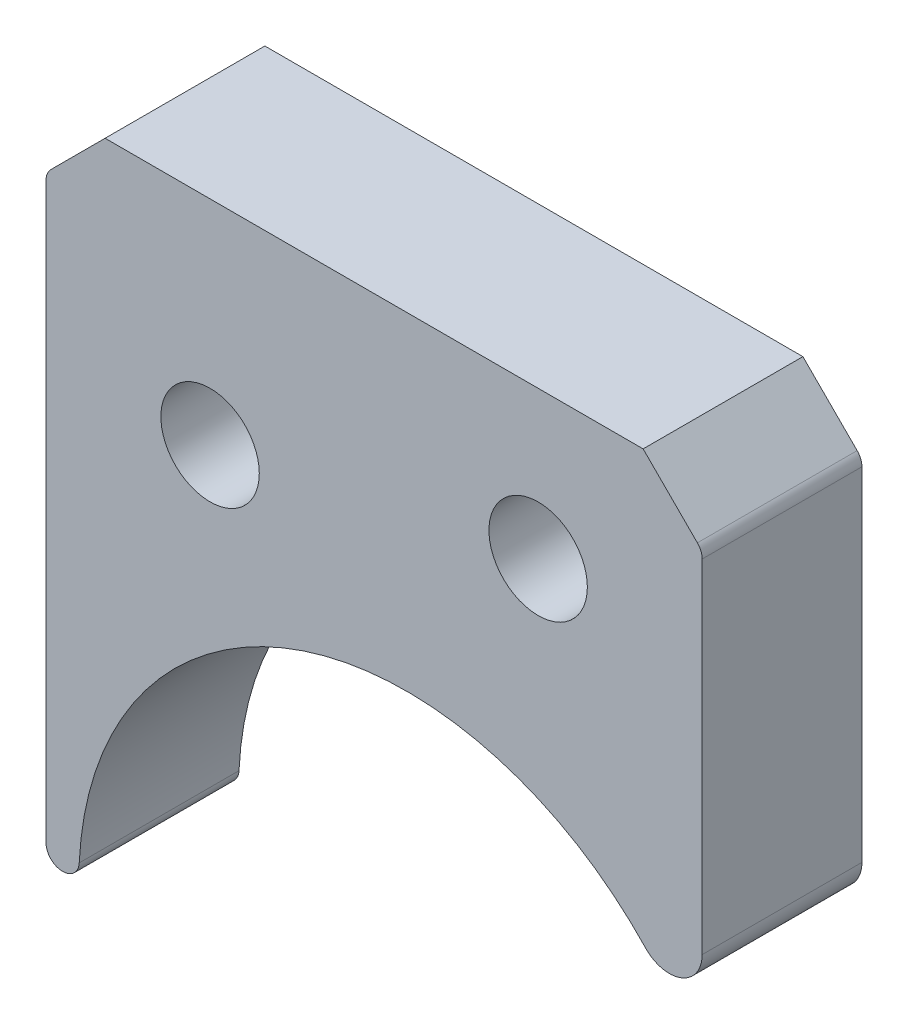
ISO-10303-21;
HEADER;
FILE_DESCRIPTION(('STEP AP214'),'2;1');
FILE_NAME('part.step','',(''),(''),'','','');
FILE_SCHEMA(('AUTOMOTIVE_DESIGN { 1 0 10303 214 1 1 1 1 }'));
ENDSEC;
DATA;
#1=APPLICATION_CONTEXT('core data for automotive mechanical design processes');
#2=APPLICATION_PROTOCOL_DEFINITION('international standard','automotive_design',2000,#1);
#3=PRODUCT_CONTEXT('',#1,'mechanical');
#4=PRODUCT('Part','Part','',(#3));
#5=PRODUCT_RELATED_PRODUCT_CATEGORY('part','',(#4));
#6=PRODUCT_DEFINITION_FORMATION('','',#4);
#7=PRODUCT_DEFINITION_CONTEXT('part definition',#1,'design');
#8=PRODUCT_DEFINITION('design','',#6,#7);
#9=PRODUCT_DEFINITION_SHAPE('','',#8);
#10=(LENGTH_UNIT() NAMED_UNIT(*) SI_UNIT(.MILLI.,.METRE.));
#11=(NAMED_UNIT(*) PLANE_ANGLE_UNIT() SI_UNIT($,.RADIAN.));
#12=(NAMED_UNIT(*) SI_UNIT($,.STERADIAN.) SOLID_ANGLE_UNIT());
#13=UNCERTAINTY_MEASURE_WITH_UNIT(LENGTH_MEASURE(1.E-05),#10,'distance_accuracy_value','');
#14=(GEOMETRIC_REPRESENTATION_CONTEXT(3) GLOBAL_UNCERTAINTY_ASSIGNED_CONTEXT((#13)) GLOBAL_UNIT_ASSIGNED_CONTEXT((#10,
#11,#12)) REPRESENTATION_CONTEXT('',''));
#15=CARTESIAN_POINT('',(0.,0.,0.));
#16=DIRECTION('',(0.,0.,1.));
#17=DIRECTION('',(1.,0.,0.));
#18=AXIS2_PLACEMENT_3D('',#15,#16,#17);
#19=CARTESIAN_POINT('',(0.,0.,4.87));
#20=DIRECTION('',(1.,0.,0.));
#21=DIRECTION('',(0.,0.,-1.));
#22=AXIS2_PLACEMENT_3D('',#19,#20,#21);
#23=PLANE('',#22);
#24=DIRECTION('',(0.,-1.,0.));
#25=VECTOR('',#24,1.);
#26=CARTESIAN_POINT('',(0.,0.,0.));
#27=LINE('',#26,#25);
#28=CARTESIAN_POINT('',(0.,17.9928932188135,0.));
#29=VERTEX_POINT('',#28);
#30=CARTESIAN_POINT('',(0.,0.5,0.));
#31=VERTEX_POINT('',#30);
#32=EDGE_CURVE('E227',#29,#31,#27,.T.);
#33=ORIENTED_EDGE('',*,*,#32,.T.);
#34=DIRECTION('',(0.,0.,-1.));
#35=VECTOR('',#34,1.);
#36=CARTESIAN_POINT('',(0.,0.5,4.87));
#37=LINE('',#36,#35);
#38=CARTESIAN_POINT('',(0.,0.5,4.87));
#39=VERTEX_POINT('',#38);
#40=EDGE_CURVE('E186',#31,#39,#37,.F.);
#41=ORIENTED_EDGE('',*,*,#40,.T.);
#42=DIRECTION('',(0.,-1.,0.));
#43=VECTOR('',#42,1.);
#44=CARTESIAN_POINT('',(0.,0.,4.87));
#45=LINE('',#44,#43);
#46=CARTESIAN_POINT('',(0.,17.9928932188135,4.87));
#47=VERTEX_POINT('',#46);
#48=EDGE_CURVE('E153',#47,#39,#45,.T.);
#49=ORIENTED_EDGE('',*,*,#48,.F.);
#50=DIRECTION('',(0.,0.,1.));
#51=VECTOR('',#50,1.);
#52=CARTESIAN_POINT('',(0.,17.9928932188135,0.));
#53=LINE('',#52,#51);
#54=EDGE_CURVE('E183',#47,#29,#53,.F.);
#55=ORIENTED_EDGE('',*,*,#54,.T.);
#56=EDGE_LOOP('',(#33,#41,#49,#55));
#57=FACE_BOUND('',#56,.T.);
#58=ADVANCED_FACE('F40',(#57),#23,.F.);
#59=CARTESIAN_POINT('',(0.,0.,4.87));
#60=DIRECTION('',(0.,1.,0.));
#61=DIRECTION('',(0.,0.,1.));
#62=AXIS2_PLACEMENT_3D('',#59,#60,#61);
#63=PLANE('',#62);
#64=DIRECTION('',(1.,0.,0.));
#65=VECTOR('',#64,1.);
#66=CARTESIAN_POINT('',(0.,0.,4.87));
#67=LINE('',#66,#65);
#68=CARTESIAN_POINT('',(0.5,0.,4.87));
#69=VERTEX_POINT('',#68);
#70=CARTESIAN_POINT('',(0.511911518298484,0.,4.87));
#71=VERTEX_POINT('',#70);
#72=EDGE_CURVE('E157',#69,#71,#67,.T.);
#73=ORIENTED_EDGE('',*,*,#72,.F.);
#74=DIRECTION('',(0.,0.,-1.));
#75=VECTOR('',#74,1.);
#76=CARTESIAN_POINT('',(0.5,0.,4.87));
#77=LINE('',#76,#75);
#78=CARTESIAN_POINT('',(0.5,0.,0.));
#79=VERTEX_POINT('',#78);
#80=EDGE_CURVE('E172',#69,#79,#77,.T.);
#81=ORIENTED_EDGE('',*,*,#80,.T.);
#82=DIRECTION('',(1.,0.,0.));
#83=VECTOR('',#82,1.);
#84=CARTESIAN_POINT('',(0.,0.,0.));
#85=LINE('',#84,#83);
#86=CARTESIAN_POINT('',(0.511911518298484,0.,0.));
#87=VERTEX_POINT('',#86);
#88=EDGE_CURVE('E230',#79,#87,#85,.T.);
#89=ORIENTED_EDGE('',*,*,#88,.T.);
#90=DIRECTION('',(0.,0.,-1.));
#91=VECTOR('',#90,1.);
#92=CARTESIAN_POINT('',(0.511911518298484,0.,4.87));
#93=LINE('',#92,#91);
#94=EDGE_CURVE('E170',#87,#71,#93,.F.);
#95=ORIENTED_EDGE('',*,*,#94,.T.);
#96=EDGE_LOOP('',(#73,#81,#89,#95));
#97=FACE_BOUND('',#96,.T.);
#98=ADVANCED_FACE('F242',(#97),#63,.F.);
#99=CARTESIAN_POINT('',(11.,0.,4.87));
#100=DIRECTION('',(0.,0.,-1.));
#101=DIRECTION('',(-1.,0.,0.));
#102=AXIS2_PLACEMENT_3D('',#99,#100,#101);
#103=CYLINDRICAL_SURFACE('',#102,10.);
#104=CARTESIAN_POINT('',(11.,0.,0.));
#105=DIRECTION('',(0.,0.,-1.));
#106=DIRECTION('',(1.,0.,0.));
#107=AXIS2_PLACEMENT_3D('',#104,#105,#106);
#108=CIRCLE('',#107,10.);
#109=CARTESIAN_POINT('',(1.01134430314141,0.476190476190476,0.));
#110=VERTEX_POINT('',#109);
#111=CARTESIAN_POINT('',(18.2727272727273,6.86348585024614,0.));
#112=VERTEX_POINT('',#111);
#113=EDGE_CURVE('E159',#110,#112,#108,.T.);
#114=ORIENTED_EDGE('',*,*,#113,.T.);
#115=DIRECTION('',(0.,0.,-1.));
#116=VECTOR('',#115,1.);
#117=CARTESIAN_POINT('',(18.2727272727273,6.86348585024614,4.87));
#118=LINE('',#117,#116);
#119=CARTESIAN_POINT('',(18.2727272727273,6.86348585024614,4.87));
#120=VERTEX_POINT('',#119);
#121=EDGE_CURVE('E48',#112,#120,#118,.F.);
#122=ORIENTED_EDGE('',*,*,#121,.T.);
#123=CARTESIAN_POINT('',(11.,0.,4.87));
#124=DIRECTION('',(0.,0.,-1.));
#125=DIRECTION('',(1.,0.,0.));
#126=AXIS2_PLACEMENT_3D('',#123,#124,#125);
#127=CIRCLE('',#126,10.);
#128=CARTESIAN_POINT('',(1.01134430314141,0.476190476190476,4.87));
#129=VERTEX_POINT('',#128);
#130=EDGE_CURVE('E221',#129,#120,#127,.T.);
#131=ORIENTED_EDGE('',*,*,#130,.F.);
#132=DIRECTION('',(0.,0.,-1.));
#133=VECTOR('',#132,1.);
#134=CARTESIAN_POINT('',(1.01134430314141,0.476190476190476,4.87));
#135=LINE('',#134,#133);
#136=EDGE_CURVE('E196',#129,#110,#135,.T.);
#137=ORIENTED_EDGE('',*,*,#136,.T.);
#138=EDGE_LOOP('',(#114,#122,#131,#137));
#139=FACE_BOUND('',#138,.T.);
#140=ADVANCED_FACE('F233',(#139),#103,.F.);
#141=CARTESIAN_POINT('',(20.,4.35889894354068,4.87));
#142=DIRECTION('',(-1.,0.,0.));
#143=DIRECTION('',(0.,0.,1.));
#144=AXIS2_PLACEMENT_3D('',#141,#142,#143);
#145=PLANE('',#144);
#146=DIRECTION('',(0.,1.,0.));
#147=VECTOR('',#146,1.);
#148=CARTESIAN_POINT('',(20.,4.35889894354068,4.87));
#149=LINE('',#148,#147);
#150=CARTESIAN_POINT('',(20.,7.54983443527076,4.87));
#151=VERTEX_POINT('',#150);
#152=CARTESIAN_POINT('',(20.,17.9928932188135,4.87));
#153=VERTEX_POINT('',#152);
#154=EDGE_CURVE('E212',#151,#153,#149,.T.);
#155=ORIENTED_EDGE('',*,*,#154,.F.);
#156=DIRECTION('',(0.,0.,-1.));
#157=VECTOR('',#156,1.);
#158=CARTESIAN_POINT('',(20.,7.54983443527076,4.87));
#159=LINE('',#158,#157);
#160=CARTESIAN_POINT('',(20.,7.54983443527076,0.));
#161=VERTEX_POINT('',#160);
#162=EDGE_CURVE('E205',#151,#161,#159,.T.);
#163=ORIENTED_EDGE('',*,*,#162,.T.);
#164=DIRECTION('',(0.,1.,0.));
#165=VECTOR('',#164,1.);
#166=CARTESIAN_POINT('',(20.,4.35889894354068,0.));
#167=LINE('',#166,#165);
#168=CARTESIAN_POINT('',(20.,17.9928932188135,0.));
#169=VERTEX_POINT('',#168);
#170=EDGE_CURVE('E154',#161,#169,#167,.T.);
#171=ORIENTED_EDGE('',*,*,#170,.T.);
#172=DIRECTION('',(0.,0.,-1.));
#173=VECTOR('',#172,1.);
#174=CARTESIAN_POINT('',(20.,17.9928932188135,4.87));
#175=LINE('',#174,#173);
#176=EDGE_CURVE('E199',#169,#153,#175,.F.);
#177=ORIENTED_EDGE('',*,*,#176,.T.);
#178=EDGE_LOOP('',(#155,#163,#171,#177));
#179=FACE_BOUND('',#178,.T.);
#180=ADVANCED_FACE('F211',(#179),#145,.F.);
#181=CARTESIAN_POINT('',(0.,20.,4.87));
#182=DIRECTION('',(0.,-1.,0.));
#183=DIRECTION('',(0.,0.,-1.));
#184=AXIS2_PLACEMENT_3D('',#181,#182,#183);
#185=PLANE('',#184);
#186=DIRECTION('',(-1.,0.,0.));
#187=VECTOR('',#186,1.);
#188=CARTESIAN_POINT('',(0.,20.,0.));
#189=LINE('',#188,#187);
#190=CARTESIAN_POINT('',(18.2,20.,0.));
#191=VERTEX_POINT('',#190);
#192=CARTESIAN_POINT('',(1.8,20.,0.));
#193=VERTEX_POINT('',#192);
#194=EDGE_CURVE('E146',#191,#193,#189,.T.);
#195=ORIENTED_EDGE('',*,*,#194,.T.);
#196=DIRECTION('',(0.,0.,1.));
#197=VECTOR('',#196,1.);
#198=CARTESIAN_POINT('',(1.8,20.,4.87));
#199=LINE('',#198,#197);
#200=CARTESIAN_POINT('',(1.8,20.,4.87));
#201=VERTEX_POINT('',#200);
#202=EDGE_CURVE('E149',#193,#201,#199,.T.);
#203=ORIENTED_EDGE('',*,*,#202,.T.);
#204=DIRECTION('',(-1.,0.,0.));
#205=VECTOR('',#204,1.);
#206=CARTESIAN_POINT('',(0.,20.,4.87));
#207=LINE('',#206,#205);
#208=CARTESIAN_POINT('',(18.2,20.,4.87));
#209=VERTEX_POINT('',#208);
#210=EDGE_CURVE('E140',#209,#201,#207,.T.);
#211=ORIENTED_EDGE('',*,*,#210,.F.);
#212=DIRECTION('',(0.,0.,-1.));
#213=VECTOR('',#212,1.);
#214=CARTESIAN_POINT('',(18.2,20.,4.87));
#215=LINE('',#214,#213);
#216=EDGE_CURVE('E133',#209,#191,#215,.T.);
#217=ORIENTED_EDGE('',*,*,#216,.T.);
#218=EDGE_LOOP('',(#195,#203,#211,#217));
#219=FACE_BOUND('',#218,.T.);
#220=ADVANCED_FACE('F145',(#219),#185,.F.);
#221=CARTESIAN_POINT('',(11.,0.,4.87));
#222=DIRECTION('',(0.,0.,1.));
#223=DIRECTION('',(1.,0.,0.));
#224=AXIS2_PLACEMENT_3D('',#221,#222,#223);
#225=PLANE('',#224);
#226=CARTESIAN_POINT('',(5.,13.5,4.87));
#227=DIRECTION('',(0.,0.,1.));
#228=DIRECTION('',(1.,0.,0.));
#229=AXIS2_PLACEMENT_3D('',#226,#227,#228);
#230=CIRCLE('',#229,1.5);
#231=CARTESIAN_POINT('',(6.5,13.5,4.87));
#232=VERTEX_POINT('',#231);
#233=EDGE_CURVE('E424',#232,#232,#230,.T.);
#234=ORIENTED_EDGE('',*,*,#233,.F.);
#235=EDGE_LOOP('',(#234));
#236=FACE_BOUND('',#235,.T.);
#237=CARTESIAN_POINT('',(15.,15.5,4.87));
#238=DIRECTION('',(0.,0.,1.));
#239=DIRECTION('',(1.,0.,0.));
#240=AXIS2_PLACEMENT_3D('',#237,#238,#239);
#241=CIRCLE('',#240,1.5);
#242=CARTESIAN_POINT('',(16.5,15.5,4.87));
#243=VERTEX_POINT('',#242);
#244=EDGE_CURVE('E422',#243,#243,#241,.T.);
#245=ORIENTED_EDGE('',*,*,#244,.F.);
#246=EDGE_LOOP('',(#245));
#247=FACE_BOUND('',#246,.T.);
#248=ORIENTED_EDGE('',*,*,#130,.T.);
#249=CARTESIAN_POINT('',(19.,7.54983443527076,4.87));
#250=DIRECTION('',(0.,0.,1.));
#251=DIRECTION('',(1.,0.,0.));
#252=AXIS2_PLACEMENT_3D('',#249,#250,#251);
#253=CIRCLE('',#252,1.);
#254=EDGE_CURVE('E11',#120,#151,#253,.T.);
#255=ORIENTED_EDGE('',*,*,#254,.T.);
#256=ORIENTED_EDGE('',*,*,#154,.T.);
#257=CARTESIAN_POINT('',(19.5,17.9928932188135,4.87));
#258=DIRECTION('',(0.,0.,1.));
#259=DIRECTION('',(1.,0.,0.));
#260=AXIS2_PLACEMENT_3D('',#257,#258,#259);
#261=CIRCLE('',#260,0.5);
#262=CARTESIAN_POINT('',(19.8535533905933,18.3464466094067,4.87));
#263=VERTEX_POINT('',#262);
#264=EDGE_CURVE('E190',#153,#263,#261,.T.);
#265=ORIENTED_EDGE('',*,*,#264,.T.);
#266=DIRECTION('',(0.707106781186546,-0.707106781186549,0.));
#267=VECTOR('',#266,1.);
#268=CARTESIAN_POINT('',(24.6,13.6,4.87));
#269=LINE('',#268,#267);
#270=EDGE_CURVE('E165',#263,#209,#269,.F.);
#271=ORIENTED_EDGE('',*,*,#270,.T.);
#272=ORIENTED_EDGE('',*,*,#210,.T.);
#273=DIRECTION('',(0.707106781186549,0.707106781186546,0.));
#274=VECTOR('',#273,1.);
#275=CARTESIAN_POINT('',(-3.59999999999998,14.6,4.87));
#276=LINE('',#275,#274);
#277=CARTESIAN_POINT('',(0.146446609406727,18.3464466094067,4.87));
#278=VERTEX_POINT('',#277);
#279=EDGE_CURVE('E167',#201,#278,#276,.F.);
#280=ORIENTED_EDGE('',*,*,#279,.T.);
#281=CARTESIAN_POINT('',(0.5,17.9928932188135,4.87));
#282=DIRECTION('',(0.,0.,1.));
#283=DIRECTION('',(1.,0.,0.));
#284=AXIS2_PLACEMENT_3D('',#281,#282,#283);
#285=CIRCLE('',#284,0.5);
#286=EDGE_CURVE('E188',#278,#47,#285,.T.);
#287=ORIENTED_EDGE('',*,*,#286,.T.);
#288=ORIENTED_EDGE('',*,*,#48,.T.);
#289=CARTESIAN_POINT('',(0.5,0.5,4.87));
#290=DIRECTION('',(0.,0.,1.));
#291=DIRECTION('',(1.,0.,0.));
#292=AXIS2_PLACEMENT_3D('',#289,#290,#291);
#293=CIRCLE('',#292,0.5);
#294=EDGE_CURVE('E194',#39,#69,#293,.T.);
#295=ORIENTED_EDGE('',*,*,#294,.T.);
#296=ORIENTED_EDGE('',*,*,#72,.T.);
#297=CARTESIAN_POINT('',(0.511911518298484,0.5,4.87));
#298=DIRECTION('',(0.,0.,1.));
#299=DIRECTION('',(1.,0.,0.));
#300=AXIS2_PLACEMENT_3D('',#297,#298,#299);
#301=CIRCLE('',#300,0.5);
#302=EDGE_CURVE('E192',#71,#129,#301,.T.);
#303=ORIENTED_EDGE('',*,*,#302,.T.);
#304=EDGE_LOOP('',(#248,#255,#256,#265,#271,#272,#280,#287,#288,#295,#296,#303));
#305=FACE_BOUND('',#304,.T.);
#306=ADVANCED_FACE('F220',(#236,#247,#305),#225,.T.);
#307=CARTESIAN_POINT('',(11.,0.,0.));
#308=DIRECTION('',(0.,0.,1.));
#309=DIRECTION('',(1.,0.,0.));
#310=AXIS2_PLACEMENT_3D('',#307,#308,#309);
#311=PLANE('',#310);
#312=CARTESIAN_POINT('',(5.,13.5,0.));
#313=DIRECTION('',(0.,0.,1.));
#314=DIRECTION('',(1.,0.,0.));
#315=AXIS2_PLACEMENT_3D('',#312,#313,#314);
#316=CIRCLE('',#315,1.5);
#317=CARTESIAN_POINT('',(6.5,13.5,0.));
#318=VERTEX_POINT('',#317);
#319=EDGE_CURVE('E231',#318,#318,#316,.T.);
#320=ORIENTED_EDGE('',*,*,#319,.T.);
#321=EDGE_LOOP('',(#320));
#322=FACE_BOUND('',#321,.T.);
#323=CARTESIAN_POINT('',(15.,15.5,0.));
#324=DIRECTION('',(0.,0.,1.));
#325=DIRECTION('',(1.,0.,0.));
#326=AXIS2_PLACEMENT_3D('',#323,#324,#325);
#327=CIRCLE('',#326,1.5);
#328=CARTESIAN_POINT('',(16.5,15.5,0.));
#329=VERTEX_POINT('',#328);
#330=EDGE_CURVE('E419',#329,#329,#327,.T.);
#331=ORIENTED_EDGE('',*,*,#330,.T.);
#332=EDGE_LOOP('',(#331));
#333=FACE_BOUND('',#332,.T.);
#334=ORIENTED_EDGE('',*,*,#170,.F.);
#335=CARTESIAN_POINT('',(19.,7.54983443527076,0.));
#336=DIRECTION('',(0.,0.,1.));
#337=DIRECTION('',(1.,0.,0.));
#338=AXIS2_PLACEMENT_3D('',#335,#336,#337);
#339=CIRCLE('',#338,1.);
#340=EDGE_CURVE('E62',#161,#112,#339,.F.);
#341=ORIENTED_EDGE('',*,*,#340,.T.);
#342=ORIENTED_EDGE('',*,*,#113,.F.);
#343=CARTESIAN_POINT('',(0.511911518298484,0.5,0.));
#344=DIRECTION('',(0.,0.,1.));
#345=DIRECTION('',(1.,0.,0.));
#346=AXIS2_PLACEMENT_3D('',#343,#344,#345);
#347=CIRCLE('',#346,0.5);
#348=EDGE_CURVE('E179',#110,#87,#347,.F.);
#349=ORIENTED_EDGE('',*,*,#348,.T.);
#350=ORIENTED_EDGE('',*,*,#88,.F.);
#351=CARTESIAN_POINT('',(0.5,0.5,0.));
#352=DIRECTION('',(0.,0.,1.));
#353=DIRECTION('',(1.,0.,0.));
#354=AXIS2_PLACEMENT_3D('',#351,#352,#353);
#355=CIRCLE('',#354,0.5);
#356=EDGE_CURVE('E181',#79,#31,#355,.F.);
#357=ORIENTED_EDGE('',*,*,#356,.T.);
#358=ORIENTED_EDGE('',*,*,#32,.F.);
#359=CARTESIAN_POINT('',(0.5,17.9928932188135,0.));
#360=DIRECTION('',(0.,0.,1.));
#361=DIRECTION('',(1.,0.,0.));
#362=AXIS2_PLACEMENT_3D('',#359,#360,#361);
#363=CIRCLE('',#362,0.5);
#364=CARTESIAN_POINT('',(0.146446609406728,18.3464466094067,0.));
#365=VERTEX_POINT('',#364);
#366=EDGE_CURVE('E175',#29,#365,#363,.F.);
#367=ORIENTED_EDGE('',*,*,#366,.T.);
#368=DIRECTION('',(-0.707106781186549,-0.707106781186546,0.));
#369=VECTOR('',#368,1.);
#370=CARTESIAN_POINT('',(0.,18.2,0.));
#371=LINE('',#370,#369);
#372=EDGE_CURVE('E139',#365,#193,#371,.F.);
#373=ORIENTED_EDGE('',*,*,#372,.T.);
#374=ORIENTED_EDGE('',*,*,#194,.F.);
#375=DIRECTION('',(-0.707106781186546,0.707106781186549,0.));
#376=VECTOR('',#375,1.);
#377=CARTESIAN_POINT('',(18.2,20.,0.));
#378=LINE('',#377,#376);
#379=CARTESIAN_POINT('',(19.8535533905933,18.3464466094067,0.));
#380=VERTEX_POINT('',#379);
#381=EDGE_CURVE('E129',#191,#380,#378,.F.);
#382=ORIENTED_EDGE('',*,*,#381,.T.);
#383=CARTESIAN_POINT('',(19.5,17.9928932188135,0.));
#384=DIRECTION('',(0.,0.,1.));
#385=DIRECTION('',(1.,0.,0.));
#386=AXIS2_PLACEMENT_3D('',#383,#384,#385);
#387=CIRCLE('',#386,0.5);
#388=EDGE_CURVE('E177',#380,#169,#387,.F.);
#389=ORIENTED_EDGE('',*,*,#388,.T.);
#390=EDGE_LOOP('',(#334,#341,#342,#349,#350,#357,#358,#367,#373,#374,#382,#389));
#391=FACE_BOUND('',#390,.T.);
#392=ADVANCED_FACE('F151',(#322,#333,#391),#311,.F.);
#393=CARTESIAN_POINT('',(15.,15.5,0.));
#394=DIRECTION('',(0.,0.,1.));
#395=DIRECTION('',(1.,0.,0.));
#396=AXIS2_PLACEMENT_3D('',#393,#394,#395);
#397=CYLINDRICAL_SURFACE('',#396,1.5);
#398=ORIENTED_EDGE('',*,*,#330,.F.);
#399=EDGE_LOOP('',(#398));
#400=FACE_BOUND('',#399,.T.);
#401=ORIENTED_EDGE('',*,*,#244,.T.);
#402=EDGE_LOOP('',(#401));
#403=FACE_BOUND('',#402,.T.);
#404=ADVANCED_FACE('F322',(#400,#403),#397,.F.);
#405=CARTESIAN_POINT('',(5.,13.5,0.));
#406=DIRECTION('',(0.,0.,1.));
#407=DIRECTION('',(1.,0.,0.));
#408=AXIS2_PLACEMENT_3D('',#405,#406,#407);
#409=CYLINDRICAL_SURFACE('',#408,1.5);
#410=ORIENTED_EDGE('',*,*,#319,.F.);
#411=EDGE_LOOP('',(#410));
#412=FACE_BOUND('',#411,.T.);
#413=ORIENTED_EDGE('',*,*,#233,.T.);
#414=EDGE_LOOP('',(#413));
#415=FACE_BOUND('',#414,.T.);
#416=ADVANCED_FACE('F259',(#412,#415),#409,.F.);
#417=CARTESIAN_POINT('',(0.,18.2,4.87));
#418=DIRECTION('',(0.707106781186546,-0.707106781186549,0.));
#419=DIRECTION('',(0.,0.,-1.));
#420=AXIS2_PLACEMENT_3D('',#417,#418,#419);
#421=PLANE('',#420);
#422=ORIENTED_EDGE('',*,*,#372,.F.);
#423=DIRECTION('',(0.,0.,-1.));
#424=VECTOR('',#423,1.);
#425=CARTESIAN_POINT('',(0.146446609406728,18.3464466094067,4.87));
#426=LINE('',#425,#424);
#427=EDGE_CURVE('E203',#365,#278,#426,.F.);
#428=ORIENTED_EDGE('',*,*,#427,.T.);
#429=ORIENTED_EDGE('',*,*,#279,.F.);
#430=ORIENTED_EDGE('',*,*,#202,.F.);
#431=EDGE_LOOP('',(#422,#428,#429,#430));
#432=FACE_BOUND('',#431,.T.);
#433=ADVANCED_FACE('F253',(#432),#421,.F.);
#434=CARTESIAN_POINT('',(18.2,20.,4.87));
#435=DIRECTION('',(-0.707106781186549,-0.707106781186546,0.));
#436=DIRECTION('',(0.,0.,-1.));
#437=AXIS2_PLACEMENT_3D('',#434,#435,#436);
#438=PLANE('',#437);
#439=ORIENTED_EDGE('',*,*,#270,.F.);
#440=DIRECTION('',(0.,0.,1.));
#441=VECTOR('',#440,1.);
#442=CARTESIAN_POINT('',(19.8535533905933,18.3464466094067,0.));
#443=LINE('',#442,#441);
#444=EDGE_CURVE('E135',#263,#380,#443,.F.);
#445=ORIENTED_EDGE('',*,*,#444,.T.);
#446=ORIENTED_EDGE('',*,*,#381,.F.);
#447=ORIENTED_EDGE('',*,*,#216,.F.);
#448=EDGE_LOOP('',(#439,#445,#446,#447));
#449=FACE_BOUND('',#448,.T.);
#450=ADVANCED_FACE('F132',(#449),#438,.F.);
#451=CARTESIAN_POINT('',(0.5,0.5,4.87));
#452=DIRECTION('',(0.,0.,-1.));
#453=DIRECTION('',(-1.,0.,0.));
#454=AXIS2_PLACEMENT_3D('',#451,#452,#453);
#455=CYLINDRICAL_SURFACE('',#454,0.5);
#456=ORIENTED_EDGE('',*,*,#294,.F.);
#457=ORIENTED_EDGE('',*,*,#40,.F.);
#458=ORIENTED_EDGE('',*,*,#356,.F.);
#459=ORIENTED_EDGE('',*,*,#80,.F.);
#460=EDGE_LOOP('',(#456,#457,#458,#459));
#461=FACE_BOUND('',#460,.T.);
#462=ADVANCED_FACE('F265',(#461),#455,.T.);
#463=CARTESIAN_POINT('',(0.511911518298484,0.5,4.87));
#464=DIRECTION('',(0.,0.,-1.));
#465=DIRECTION('',(-1.,0.,0.));
#466=AXIS2_PLACEMENT_3D('',#463,#464,#465);
#467=CYLINDRICAL_SURFACE('',#466,0.5);
#468=ORIENTED_EDGE('',*,*,#302,.F.);
#469=ORIENTED_EDGE('',*,*,#94,.F.);
#470=ORIENTED_EDGE('',*,*,#348,.F.);
#471=ORIENTED_EDGE('',*,*,#136,.F.);
#472=EDGE_LOOP('',(#468,#469,#470,#471));
#473=FACE_BOUND('',#472,.T.);
#474=ADVANCED_FACE('F268',(#473),#467,.T.);
#475=CARTESIAN_POINT('',(19.5,17.9928932188135,4.87));
#476=DIRECTION('',(0.,0.,1.));
#477=DIRECTION('',(1.,0.,0.));
#478=AXIS2_PLACEMENT_3D('',#475,#476,#477);
#479=CYLINDRICAL_SURFACE('',#478,0.5);
#480=ORIENTED_EDGE('',*,*,#388,.F.);
#481=ORIENTED_EDGE('',*,*,#444,.F.);
#482=ORIENTED_EDGE('',*,*,#264,.F.);
#483=ORIENTED_EDGE('',*,*,#176,.F.);
#484=EDGE_LOOP('',(#480,#481,#482,#483));
#485=FACE_BOUND('',#484,.T.);
#486=ADVANCED_FACE('F218',(#485),#479,.T.);
#487=CARTESIAN_POINT('',(0.5,17.9928932188135,4.87));
#488=DIRECTION('',(0.,0.,-1.));
#489=DIRECTION('',(-1.,0.,0.));
#490=AXIS2_PLACEMENT_3D('',#487,#488,#489);
#491=CYLINDRICAL_SURFACE('',#490,0.5);
#492=ORIENTED_EDGE('',*,*,#286,.F.);
#493=ORIENTED_EDGE('',*,*,#427,.F.);
#494=ORIENTED_EDGE('',*,*,#366,.F.);
#495=ORIENTED_EDGE('',*,*,#54,.F.);
#496=EDGE_LOOP('',(#492,#493,#494,#495));
#497=FACE_BOUND('',#496,.T.);
#498=ADVANCED_FACE('F236',(#497),#491,.T.);
#499=CARTESIAN_POINT('',(19.,7.54983443527076,4.87));
#500=DIRECTION('',(0.,0.,-1.));
#501=DIRECTION('',(-1.,0.,0.));
#502=AXIS2_PLACEMENT_3D('',#499,#500,#501);
#503=CYLINDRICAL_SURFACE('',#502,1.);
#504=ORIENTED_EDGE('',*,*,#254,.F.);
#505=ORIENTED_EDGE('',*,*,#121,.F.);
#506=ORIENTED_EDGE('',*,*,#340,.F.);
#507=ORIENTED_EDGE('',*,*,#162,.F.);
#508=EDGE_LOOP('',(#504,#505,#506,#507));
#509=FACE_BOUND('',#508,.T.);
#510=ADVANCED_FACE('F42',(#509),#503,.T.);
#511=CLOSED_SHELL('',(#58,#98,#140,#180,#220,#306,#392,#404,#416,#433,#450,#462,#474,#486,#498,#510));
#512=MANIFOLD_SOLID_BREP('B2',#511);
#513=ADVANCED_BREP_SHAPE_REPRESENTATION('',(#18,#512),#14);
#514=SHAPE_DEFINITION_REPRESENTATION(#9,#513);
ENDSEC;
END-ISO-10303-21;
